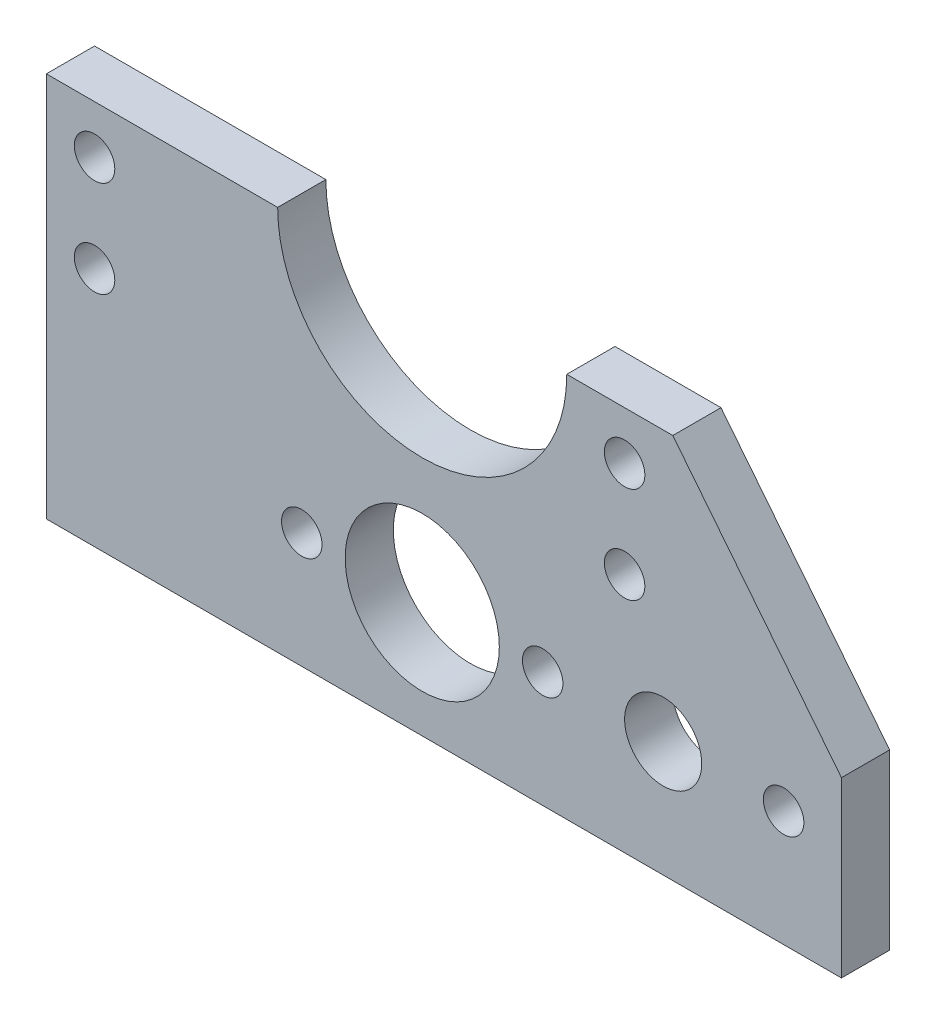
ISO-10303-21;
HEADER;
FILE_DESCRIPTION(('STEP AP214'),'2;1');
FILE_NAME('part.step','',(''),(''),'','','');
FILE_SCHEMA(('AUTOMOTIVE_DESIGN { 1 0 10303 214 1 1 1 1 }'));
ENDSEC;
DATA;
#1=APPLICATION_CONTEXT('core data for automotive mechanical design processes');
#2=APPLICATION_PROTOCOL_DEFINITION('international standard','automotive_design',2000,#1);
#3=PRODUCT_CONTEXT('',#1,'mechanical');
#4=PRODUCT('Part','Part','',(#3));
#5=PRODUCT_RELATED_PRODUCT_CATEGORY('part','',(#4));
#6=PRODUCT_DEFINITION_FORMATION('','',#4);
#7=PRODUCT_DEFINITION_CONTEXT('part definition',#1,'design');
#8=PRODUCT_DEFINITION('design','',#6,#7);
#9=PRODUCT_DEFINITION_SHAPE('','',#8);
#10=(LENGTH_UNIT() NAMED_UNIT(*) SI_UNIT(.MILLI.,.METRE.));
#11=(NAMED_UNIT(*) PLANE_ANGLE_UNIT() SI_UNIT($,.RADIAN.));
#12=(NAMED_UNIT(*) SI_UNIT($,.STERADIAN.) SOLID_ANGLE_UNIT());
#13=UNCERTAINTY_MEASURE_WITH_UNIT(LENGTH_MEASURE(1.E-05),#10,'distance_accuracy_value','');
#14=(GEOMETRIC_REPRESENTATION_CONTEXT(3) GLOBAL_UNCERTAINTY_ASSIGNED_CONTEXT((#13)) GLOBAL_UNIT_ASSIGNED_CONTEXT((#10,
#11,#12)) REPRESENTATION_CONTEXT('',''));
#15=CARTESIAN_POINT('',(0.,0.,0.));
#16=DIRECTION('',(0.,0.,1.));
#17=DIRECTION('',(1.,0.,0.));
#18=AXIS2_PLACEMENT_3D('',#15,#16,#17);
#19=CARTESIAN_POINT('',(116.611470678347,15.3385093167702,5.));
#20=DIRECTION('',(0.,-1.,0.));
#21=DIRECTION('',(1.,0.,0.));
#22=AXIS2_PLACEMENT_3D('',#19,#20,#21);
#23=PLANE('',#22);
#24=DIRECTION('',(-1.,0.,0.));
#25=VECTOR('',#24,1.);
#26=CARTESIAN_POINT('',(116.611470678347,15.3385093167702,0.));
#27=LINE('',#26,#25);
#28=CARTESIAN_POINT('',(116.611470678347,15.3385093167702,0.));
#29=VERTEX_POINT('',#28);
#30=CARTESIAN_POINT('',(105.611470678347,15.3385093167702,0.));
#31=VERTEX_POINT('',#30);
#32=EDGE_CURVE('E136',#29,#31,#27,.T.);
#33=ORIENTED_EDGE('',*,*,#32,.T.);
#34=DIRECTION('',(0.,0.,1.));
#35=VECTOR('',#34,1.);
#36=CARTESIAN_POINT('',(105.611470678347,15.3385093167702,-5.));
#37=LINE('',#36,#35);
#38=CARTESIAN_POINT('',(105.611470678347,15.3385093167702,5.));
#39=VERTEX_POINT('',#38);
#40=EDGE_CURVE('E11',#31,#39,#37,.T.);
#41=ORIENTED_EDGE('',*,*,#40,.T.);
#42=DIRECTION('',(-1.,0.,0.));
#43=VECTOR('',#42,1.);
#44=CARTESIAN_POINT('',(116.611470678347,15.3385093167702,5.));
#45=LINE('',#44,#43);
#46=CARTESIAN_POINT('',(116.611470678347,15.3385093167702,5.));
#47=VERTEX_POINT('',#46);
#48=EDGE_CURVE('E125',#47,#39,#45,.T.);
#49=ORIENTED_EDGE('',*,*,#48,.F.);
#50=DIRECTION('',(0.,0.,-1.));
#51=VECTOR('',#50,1.);
#52=CARTESIAN_POINT('',(116.611470678347,15.3385093167702,5.));
#53=LINE('',#52,#51);
#54=EDGE_CURVE('E119',#47,#29,#53,.T.);
#55=ORIENTED_EDGE('',*,*,#54,.T.);
#56=EDGE_LOOP('',(#33,#41,#49,#55));
#57=FACE_BOUND('',#56,.T.);
#58=ADVANCED_FACE('F36',(#57),#23,.F.);
#59=CARTESIAN_POINT('',(0.,0.,5.));
#60=DIRECTION('',(0.,0.,1.));
#61=DIRECTION('',(1.,0.,0.));
#62=AXIS2_PLACEMENT_3D('',#59,#60,#61);
#63=PLANE('',#62);
#64=CARTESIAN_POINT('',(90.6114706783472,15.3385093167702,5.));
#65=DIRECTION('',(0.,0.,1.));
#66=DIRECTION('',(1.,0.,0.));
#67=AXIS2_PLACEMENT_3D('',#64,#65,#66);
#68=CIRCLE('',#67,15.);
#69=CARTESIAN_POINT('',(75.6114706783472,15.3385093167702,5.));
#70=VERTEX_POINT('',#69);
#71=EDGE_CURVE('E160',#70,#39,#68,.T.);
#72=ORIENTED_EDGE('',*,*,#71,.F.);
#73=CARTESIAN_POINT('',(51.6114706783472,15.3385093167702,5.));
#74=VERTEX_POINT('',#73);
#75=EDGE_CURVE('E60',#70,#74,#45,.T.);
#76=ORIENTED_EDGE('',*,*,#75,.T.);
#77=DIRECTION('',(0.,-1.,0.));
#78=VECTOR('',#77,1.);
#79=CARTESIAN_POINT('',(51.6114706783472,-6.6614906832298,5.));
#80=LINE('',#79,#78);
#81=CARTESIAN_POINT('',(51.6114706783472,-24.6614906832298,5.));
#82=VERTEX_POINT('',#81);
#83=EDGE_CURVE('E142',#74,#82,#80,.T.);
#84=ORIENTED_EDGE('',*,*,#83,.T.);
#85=DIRECTION('',(1.,0.,0.));
#86=VECTOR('',#85,1.);
#87=CARTESIAN_POINT('',(51.6114706783472,-24.6614906832298,5.));
#88=LINE('',#87,#86);
#89=CARTESIAN_POINT('',(134.111470678347,-24.6614906832298,5.));
#90=VERTEX_POINT('',#89);
#91=EDGE_CURVE('E94',#82,#90,#88,.T.);
#92=ORIENTED_EDGE('',*,*,#91,.T.);
#93=DIRECTION('',(0.,1.,0.));
#94=VECTOR('',#93,1.);
#95=CARTESIAN_POINT('',(134.111470678347,-6.66149068322979,5.));
#96=LINE('',#95,#94);
#97=CARTESIAN_POINT('',(134.111470678347,-6.66149068322979,5.));
#98=VERTEX_POINT('',#97);
#99=EDGE_CURVE('E100',#90,#98,#96,.T.);
#100=ORIENTED_EDGE('',*,*,#99,.T.);
#101=DIRECTION('',(-0.622523565821539,0.782601054175649,0.));
#102=VECTOR('',#101,1.);
#103=CARTESIAN_POINT('',(116.611470678347,15.3385093167702,5.));
#104=LINE('',#103,#102);
#105=EDGE_CURVE('E106',#98,#47,#104,.T.);
#106=ORIENTED_EDGE('',*,*,#105,.T.);
#107=ORIENTED_EDGE('',*,*,#48,.T.);
#108=EDGE_LOOP('',(#72,#76,#84,#92,#100,#106,#107));
#109=FACE_BOUND('',#108,.T.);
#110=CARTESIAN_POINT('',(103.111470678347,-12.6614906832298,5.));
#111=DIRECTION('',(0.,0.,1.));
#112=DIRECTION('',(1.,0.,0.));
#113=AXIS2_PLACEMENT_3D('',#110,#111,#112);
#114=CIRCLE('',#113,2.1);
#115=CARTESIAN_POINT('',(105.211470678347,-12.6614906832298,5.));
#116=VERTEX_POINT('',#115);
#117=EDGE_CURVE('E233',#116,#116,#114,.T.);
#118=ORIENTED_EDGE('',*,*,#117,.F.);
#119=EDGE_LOOP('',(#118));
#120=FACE_BOUND('',#119,.T.);
#121=CARTESIAN_POINT('',(90.6114706783472,-12.6614906832298,5.));
#122=DIRECTION('',(0.,0.,1.));
#123=DIRECTION('',(1.,0.,0.));
#124=AXIS2_PLACEMENT_3D('',#121,#122,#123);
#125=CIRCLE('',#124,8.00000000000001);
#126=CARTESIAN_POINT('',(98.6114706783472,-12.6614906832298,5.));
#127=VERTEX_POINT('',#126);
#128=EDGE_CURVE('E253',#127,#127,#125,.T.);
#129=ORIENTED_EDGE('',*,*,#128,.F.);
#130=EDGE_LOOP('',(#129));
#131=FACE_BOUND('',#130,.T.);
#132=CARTESIAN_POINT('',(111.611470678347,0.338509316770208,5.));
#133=DIRECTION('',(0.,0.,1.));
#134=DIRECTION('',(1.,0.,0.));
#135=AXIS2_PLACEMENT_3D('',#132,#133,#134);
#136=CIRCLE('',#135,2.10000000000002);
#137=CARTESIAN_POINT('',(113.711470678347,0.338509316770208,5.));
#138=VERTEX_POINT('',#137);
#139=EDGE_CURVE('E265',#138,#138,#136,.T.);
#140=ORIENTED_EDGE('',*,*,#139,.F.);
#141=EDGE_LOOP('',(#140));
#142=FACE_BOUND('',#141,.T.);
#143=CARTESIAN_POINT('',(111.611470678347,10.3385093167702,5.));
#144=DIRECTION('',(0.,0.,1.));
#145=DIRECTION('',(1.,0.,0.));
#146=AXIS2_PLACEMENT_3D('',#143,#144,#145);
#147=CIRCLE('',#146,2.09999999999999);
#148=CARTESIAN_POINT('',(113.711470678347,10.3385093167702,5.));
#149=VERTEX_POINT('',#148);
#150=EDGE_CURVE('E277',#149,#149,#147,.T.);
#151=ORIENTED_EDGE('',*,*,#150,.F.);
#152=EDGE_LOOP('',(#151));
#153=FACE_BOUND('',#152,.T.);
#154=CARTESIAN_POINT('',(56.6114706783472,10.3385093167702,5.));
#155=DIRECTION('',(0.,0.,1.));
#156=DIRECTION('',(1.,0.,0.));
#157=AXIS2_PLACEMENT_3D('',#154,#155,#156);
#158=CIRCLE('',#157,2.09999999999999);
#159=CARTESIAN_POINT('',(58.7114706783471,10.3385093167702,5.));
#160=VERTEX_POINT('',#159);
#161=EDGE_CURVE('E132',#160,#160,#158,.T.);
#162=ORIENTED_EDGE('',*,*,#161,.F.);
#163=EDGE_LOOP('',(#162));
#164=FACE_BOUND('',#163,.T.);
#165=CARTESIAN_POINT('',(56.6114706783472,0.338509316770203,5.));
#166=DIRECTION('',(0.,0.,1.));
#167=DIRECTION('',(1.,0.,0.));
#168=AXIS2_PLACEMENT_3D('',#165,#166,#167);
#169=CIRCLE('',#168,2.09999999999999);
#170=CARTESIAN_POINT('',(58.7114706783471,0.338509316770203,5.));
#171=VERTEX_POINT('',#170);
#172=EDGE_CURVE('E271',#171,#171,#169,.T.);
#173=ORIENTED_EDGE('',*,*,#172,.F.);
#174=EDGE_LOOP('',(#173));
#175=FACE_BOUND('',#174,.T.);
#176=CARTESIAN_POINT('',(115.611470678347,-12.6614906832298,5.));
#177=DIRECTION('',(0.,0.,1.));
#178=DIRECTION('',(1.,0.,0.));
#179=AXIS2_PLACEMENT_3D('',#176,#177,#178);
#180=CIRCLE('',#179,4.00000000000001);
#181=CARTESIAN_POINT('',(119.611470678347,-12.6614906832298,5.));
#182=VERTEX_POINT('',#181);
#183=EDGE_CURVE('E259',#182,#182,#180,.T.);
#184=ORIENTED_EDGE('',*,*,#183,.F.);
#185=EDGE_LOOP('',(#184));
#186=FACE_BOUND('',#185,.T.);
#187=CARTESIAN_POINT('',(78.1114706783472,-12.6614906832298,5.));
#188=DIRECTION('',(0.,0.,1.));
#189=DIRECTION('',(1.,0.,0.));
#190=AXIS2_PLACEMENT_3D('',#187,#188,#189);
#191=CIRCLE('',#190,2.1);
#192=CARTESIAN_POINT('',(80.2114706783472,-12.6614906832298,5.));
#193=VERTEX_POINT('',#192);
#194=EDGE_CURVE('E247',#193,#193,#191,.T.);
#195=ORIENTED_EDGE('',*,*,#194,.F.);
#196=EDGE_LOOP('',(#195));
#197=FACE_BOUND('',#196,.T.);
#198=CARTESIAN_POINT('',(128.111470678347,-12.6614906832298,5.));
#199=DIRECTION('',(0.,0.,1.));
#200=DIRECTION('',(1.,0.,0.));
#201=AXIS2_PLACEMENT_3D('',#198,#199,#200);
#202=CIRCLE('',#201,2.09999999999999);
#203=CARTESIAN_POINT('',(130.211470678347,-12.6614906832298,5.));
#204=VERTEX_POINT('',#203);
#205=EDGE_CURVE('E238',#204,#204,#202,.T.);
#206=ORIENTED_EDGE('',*,*,#205,.F.);
#207=EDGE_LOOP('',(#206));
#208=FACE_BOUND('',#207,.T.);
#209=ADVANCED_FACE('F102',(#109,#120,#131,#142,#153,#164,#175,#186,#197,#208),#63,.T.);
#210=CARTESIAN_POINT('',(0.,0.,0.));
#211=DIRECTION('',(0.,0.,1.));
#212=DIRECTION('',(1.,0.,0.));
#213=AXIS2_PLACEMENT_3D('',#210,#211,#212);
#214=PLANE('',#213);
#215=CARTESIAN_POINT('',(75.6114706783472,15.3385093167702,0.));
#216=VERTEX_POINT('',#215);
#217=CARTESIAN_POINT('',(51.6114706783472,15.3385093167702,0.));
#218=VERTEX_POINT('',#217);
#219=EDGE_CURVE('E85',#216,#218,#27,.T.);
#220=ORIENTED_EDGE('',*,*,#219,.F.);
#221=CARTESIAN_POINT('',(90.6114706783472,15.3385093167702,0.));
#222=DIRECTION('',(0.,0.,1.));
#223=DIRECTION('',(1.,0.,0.));
#224=AXIS2_PLACEMENT_3D('',#221,#222,#223);
#225=CIRCLE('',#224,15.);
#226=EDGE_CURVE('E51',#216,#31,#225,.T.);
#227=ORIENTED_EDGE('',*,*,#226,.T.);
#228=ORIENTED_EDGE('',*,*,#32,.F.);
#229=DIRECTION('',(-0.622523565821539,0.782601054175649,0.));
#230=VECTOR('',#229,1.);
#231=CARTESIAN_POINT('',(116.611470678347,15.3385093167702,0.));
#232=LINE('',#231,#230);
#233=CARTESIAN_POINT('',(134.111470678347,-6.66149068322979,0.));
#234=VERTEX_POINT('',#233);
#235=EDGE_CURVE('E134',#234,#29,#232,.T.);
#236=ORIENTED_EDGE('',*,*,#235,.F.);
#237=DIRECTION('',(0.,1.,0.));
#238=VECTOR('',#237,1.);
#239=CARTESIAN_POINT('',(134.111470678347,-6.66149068322979,0.));
#240=LINE('',#239,#238);
#241=CARTESIAN_POINT('',(134.111470678347,-24.6614906832298,0.));
#242=VERTEX_POINT('',#241);
#243=EDGE_CURVE('E115',#242,#234,#240,.T.);
#244=ORIENTED_EDGE('',*,*,#243,.F.);
#245=DIRECTION('',(1.,0.,0.));
#246=VECTOR('',#245,1.);
#247=CARTESIAN_POINT('',(134.111470678347,-24.6614906832298,0.));
#248=LINE('',#247,#246);
#249=CARTESIAN_POINT('',(51.6114706783472,-24.6614906832298,0.));
#250=VERTEX_POINT('',#249);
#251=EDGE_CURVE('E130',#250,#242,#248,.T.);
#252=ORIENTED_EDGE('',*,*,#251,.F.);
#253=DIRECTION('',(0.,-1.,0.));
#254=VECTOR('',#253,1.);
#255=CARTESIAN_POINT('',(51.6114706783472,15.3385093167702,0.));
#256=LINE('',#255,#254);
#257=EDGE_CURVE('E139',#218,#250,#256,.T.);
#258=ORIENTED_EDGE('',*,*,#257,.F.);
#259=EDGE_LOOP('',(#220,#227,#228,#236,#244,#252,#258));
#260=FACE_BOUND('',#259,.T.);
#261=CARTESIAN_POINT('',(56.6114706783472,10.3385093167702,0.));
#262=DIRECTION('',(0.,0.,1.));
#263=DIRECTION('',(1.,0.,0.));
#264=AXIS2_PLACEMENT_3D('',#261,#262,#263);
#265=CIRCLE('',#264,2.09999999999999);
#266=CARTESIAN_POINT('',(58.7114706783471,10.3385093167702,0.));
#267=VERTEX_POINT('',#266);
#268=EDGE_CURVE('E280',#267,#267,#265,.T.);
#269=ORIENTED_EDGE('',*,*,#268,.T.);
#270=EDGE_LOOP('',(#269));
#271=FACE_BOUND('',#270,.T.);
#272=CARTESIAN_POINT('',(111.611470678347,10.3385093167702,0.));
#273=DIRECTION('',(0.,0.,1.));
#274=DIRECTION('',(1.,0.,0.));
#275=AXIS2_PLACEMENT_3D('',#272,#273,#274);
#276=CIRCLE('',#275,2.09999999999999);
#277=CARTESIAN_POINT('',(113.711470678347,10.3385093167702,0.));
#278=VERTEX_POINT('',#277);
#279=EDGE_CURVE('E274',#278,#278,#276,.T.);
#280=ORIENTED_EDGE('',*,*,#279,.T.);
#281=EDGE_LOOP('',(#280));
#282=FACE_BOUND('',#281,.T.);
#283=CARTESIAN_POINT('',(56.6114706783472,0.338509316770203,0.));
#284=DIRECTION('',(0.,0.,1.));
#285=DIRECTION('',(1.,0.,0.));
#286=AXIS2_PLACEMENT_3D('',#283,#284,#285);
#287=CIRCLE('',#286,2.09999999999999);
#288=CARTESIAN_POINT('',(58.7114706783471,0.338509316770203,0.));
#289=VERTEX_POINT('',#288);
#290=EDGE_CURVE('E268',#289,#289,#287,.T.);
#291=ORIENTED_EDGE('',*,*,#290,.T.);
#292=EDGE_LOOP('',(#291));
#293=FACE_BOUND('',#292,.T.);
#294=CARTESIAN_POINT('',(111.611470678347,0.338509316770208,0.));
#295=DIRECTION('',(0.,0.,1.));
#296=DIRECTION('',(1.,0.,0.));
#297=AXIS2_PLACEMENT_3D('',#294,#295,#296);
#298=CIRCLE('',#297,2.10000000000002);
#299=CARTESIAN_POINT('',(113.711470678347,0.338509316770208,0.));
#300=VERTEX_POINT('',#299);
#301=EDGE_CURVE('E262',#300,#300,#298,.T.);
#302=ORIENTED_EDGE('',*,*,#301,.T.);
#303=EDGE_LOOP('',(#302));
#304=FACE_BOUND('',#303,.T.);
#305=CARTESIAN_POINT('',(115.611470678347,-12.6614906832298,0.));
#306=DIRECTION('',(0.,0.,1.));
#307=DIRECTION('',(1.,0.,0.));
#308=AXIS2_PLACEMENT_3D('',#305,#306,#307);
#309=CIRCLE('',#308,4.00000000000001);
#310=CARTESIAN_POINT('',(119.611470678347,-12.6614906832298,0.));
#311=VERTEX_POINT('',#310);
#312=EDGE_CURVE('E256',#311,#311,#309,.T.);
#313=ORIENTED_EDGE('',*,*,#312,.T.);
#314=EDGE_LOOP('',(#313));
#315=FACE_BOUND('',#314,.T.);
#316=CARTESIAN_POINT('',(90.6114706783472,-12.6614906832298,0.));
#317=DIRECTION('',(0.,0.,1.));
#318=DIRECTION('',(1.,0.,0.));
#319=AXIS2_PLACEMENT_3D('',#316,#317,#318);
#320=CIRCLE('',#319,8.00000000000001);
#321=CARTESIAN_POINT('',(98.6114706783472,-12.6614906832298,0.));
#322=VERTEX_POINT('',#321);
#323=EDGE_CURVE('E250',#322,#322,#320,.T.);
#324=ORIENTED_EDGE('',*,*,#323,.T.);
#325=EDGE_LOOP('',(#324));
#326=FACE_BOUND('',#325,.T.);
#327=CARTESIAN_POINT('',(78.1114706783472,-12.6614906832298,0.));
#328=DIRECTION('',(0.,0.,1.));
#329=DIRECTION('',(1.,0.,0.));
#330=AXIS2_PLACEMENT_3D('',#327,#328,#329);
#331=CIRCLE('',#330,2.1);
#332=CARTESIAN_POINT('',(80.2114706783472,-12.6614906832298,0.));
#333=VERTEX_POINT('',#332);
#334=EDGE_CURVE('E240',#333,#333,#331,.T.);
#335=ORIENTED_EDGE('',*,*,#334,.T.);
#336=EDGE_LOOP('',(#335));
#337=FACE_BOUND('',#336,.T.);
#338=CARTESIAN_POINT('',(103.111470678347,-12.6614906832298,0.));
#339=DIRECTION('',(0.,0.,1.));
#340=DIRECTION('',(1.,0.,0.));
#341=AXIS2_PLACEMENT_3D('',#338,#339,#340);
#342=CIRCLE('',#341,2.1);
#343=CARTESIAN_POINT('',(105.211470678347,-12.6614906832298,0.));
#344=VERTEX_POINT('',#343);
#345=EDGE_CURVE('E236',#344,#344,#342,.T.);
#346=ORIENTED_EDGE('',*,*,#345,.T.);
#347=EDGE_LOOP('',(#346));
#348=FACE_BOUND('',#347,.T.);
#349=CARTESIAN_POINT('',(128.111470678347,-12.6614906832298,0.));
#350=DIRECTION('',(0.,0.,1.));
#351=DIRECTION('',(1.,0.,0.));
#352=AXIS2_PLACEMENT_3D('',#349,#350,#351);
#353=CIRCLE('',#352,2.09999999999999);
#354=CARTESIAN_POINT('',(130.211470678347,-12.6614906832298,0.));
#355=VERTEX_POINT('',#354);
#356=EDGE_CURVE('E243',#355,#355,#353,.T.);
#357=ORIENTED_EDGE('',*,*,#356,.T.);
#358=EDGE_LOOP('',(#357));
#359=FACE_BOUND('',#358,.T.);
#360=ADVANCED_FACE('F152',(#260,#271,#282,#293,#304,#315,#326,#337,#348,#359),#214,.F.);
#361=CARTESIAN_POINT('',(134.111470678347,-24.6614906832298,5.));
#362=DIRECTION('',(0.,1.,0.));
#363=DIRECTION('',(-1.,0.,0.));
#364=AXIS2_PLACEMENT_3D('',#361,#362,#363);
#365=PLANE('',#364);
#366=ORIENTED_EDGE('',*,*,#251,.T.);
#367=DIRECTION('',(0.,0.,-1.));
#368=VECTOR('',#367,1.);
#369=CARTESIAN_POINT('',(134.111470678347,-24.6614906832298,5.));
#370=LINE('',#369,#368);
#371=EDGE_CURVE('E118',#90,#242,#370,.T.);
#372=ORIENTED_EDGE('',*,*,#371,.F.);
#373=ORIENTED_EDGE('',*,*,#91,.F.);
#374=DIRECTION('',(0.,0.,-1.));
#375=VECTOR('',#374,1.);
#376=CARTESIAN_POINT('',(51.6114706783472,-24.6614906832298,5.));
#377=LINE('',#376,#375);
#378=EDGE_CURVE('E146',#82,#250,#377,.T.);
#379=ORIENTED_EDGE('',*,*,#378,.T.);
#380=EDGE_LOOP('',(#366,#372,#373,#379));
#381=FACE_BOUND('',#380,.T.);
#382=ADVANCED_FACE('F38',(#381),#365,.F.);
#383=CARTESIAN_POINT('',(134.111470678347,-6.66149068322979,5.));
#384=DIRECTION('',(-1.,0.,0.));
#385=DIRECTION('',(0.,0.,1.));
#386=AXIS2_PLACEMENT_3D('',#383,#384,#385);
#387=PLANE('',#386);
#388=ORIENTED_EDGE('',*,*,#243,.T.);
#389=DIRECTION('',(0.,0.,-1.));
#390=VECTOR('',#389,1.);
#391=CARTESIAN_POINT('',(134.111470678347,-6.66149068322979,5.));
#392=LINE('',#391,#390);
#393=EDGE_CURVE('E112',#98,#234,#392,.T.);
#394=ORIENTED_EDGE('',*,*,#393,.F.);
#395=ORIENTED_EDGE('',*,*,#99,.F.);
#396=ORIENTED_EDGE('',*,*,#371,.T.);
#397=EDGE_LOOP('',(#388,#394,#395,#396));
#398=FACE_BOUND('',#397,.T.);
#399=ADVANCED_FACE('F113',(#398),#387,.F.);
#400=CARTESIAN_POINT('',(116.611470678347,15.3385093167702,5.));
#401=DIRECTION('',(-0.782601054175649,-0.622523565821539,0.));
#402=DIRECTION('',(0.622523565821539,-0.782601054175649,0.));
#403=AXIS2_PLACEMENT_3D('',#400,#401,#402);
#404=PLANE('',#403);
#405=ORIENTED_EDGE('',*,*,#235,.T.);
#406=ORIENTED_EDGE('',*,*,#54,.F.);
#407=ORIENTED_EDGE('',*,*,#105,.F.);
#408=ORIENTED_EDGE('',*,*,#393,.T.);
#409=EDGE_LOOP('',(#405,#406,#407,#408));
#410=FACE_BOUND('',#409,.T.);
#411=ADVANCED_FACE('F121',(#410),#404,.F.);
#412=ORIENTED_EDGE('',*,*,#75,.F.);
#413=DIRECTION('',(0.,0.,1.));
#414=VECTOR('',#413,1.);
#415=CARTESIAN_POINT('',(75.6114706783472,15.3385093167702,-5.));
#416=LINE('',#415,#414);
#417=EDGE_CURVE('E44',#70,#216,#416,.F.);
#418=ORIENTED_EDGE('',*,*,#417,.T.);
#419=ORIENTED_EDGE('',*,*,#219,.T.);
#420=DIRECTION('',(0.,0.,-1.));
#421=VECTOR('',#420,1.);
#422=CARTESIAN_POINT('',(51.6114706783472,15.3385093167702,5.));
#423=LINE('',#422,#421);
#424=EDGE_CURVE('E129',#74,#218,#423,.T.);
#425=ORIENTED_EDGE('',*,*,#424,.F.);
#426=EDGE_LOOP('',(#412,#418,#419,#425));
#427=FACE_BOUND('',#426,.T.);
#428=ADVANCED_FACE('F147',(#427),#23,.F.);
#429=CARTESIAN_POINT('',(51.6114706783472,15.3385093167702,5.));
#430=DIRECTION('',(1.,0.,0.));
#431=DIRECTION('',(0.,0.,-1.));
#432=AXIS2_PLACEMENT_3D('',#429,#430,#431);
#433=PLANE('',#432);
#434=ORIENTED_EDGE('',*,*,#257,.T.);
#435=ORIENTED_EDGE('',*,*,#378,.F.);
#436=ORIENTED_EDGE('',*,*,#83,.F.);
#437=ORIENTED_EDGE('',*,*,#424,.T.);
#438=EDGE_LOOP('',(#434,#435,#436,#437));
#439=FACE_BOUND('',#438,.T.);
#440=ADVANCED_FACE('F157',(#439),#433,.F.);
#441=CARTESIAN_POINT('',(56.6114706783472,10.3385093167702,5.));
#442=DIRECTION('',(0.,0.,-1.));
#443=DIRECTION('',(-1.,0.,0.));
#444=AXIS2_PLACEMENT_3D('',#441,#442,#443);
#445=CYLINDRICAL_SURFACE('',#444,2.09999999999999);
#446=ORIENTED_EDGE('',*,*,#161,.T.);
#447=EDGE_LOOP('',(#446));
#448=FACE_BOUND('',#447,.T.);
#449=ORIENTED_EDGE('',*,*,#268,.F.);
#450=EDGE_LOOP('',(#449));
#451=FACE_BOUND('',#450,.T.);
#452=ADVANCED_FACE('F185',(#448,#451),#445,.F.);
#453=CARTESIAN_POINT('',(111.611470678347,10.3385093167702,5.));
#454=DIRECTION('',(0.,0.,-1.));
#455=DIRECTION('',(-1.,0.,0.));
#456=AXIS2_PLACEMENT_3D('',#453,#454,#455);
#457=CYLINDRICAL_SURFACE('',#456,2.09999999999999);
#458=ORIENTED_EDGE('',*,*,#150,.T.);
#459=EDGE_LOOP('',(#458));
#460=FACE_BOUND('',#459,.T.);
#461=ORIENTED_EDGE('',*,*,#279,.F.);
#462=EDGE_LOOP('',(#461));
#463=FACE_BOUND('',#462,.T.);
#464=ADVANCED_FACE('F201',(#460,#463),#457,.F.);
#465=CARTESIAN_POINT('',(56.6114706783472,0.338509316770203,5.));
#466=DIRECTION('',(0.,0.,-1.));
#467=DIRECTION('',(-1.,0.,0.));
#468=AXIS2_PLACEMENT_3D('',#465,#466,#467);
#469=CYLINDRICAL_SURFACE('',#468,2.09999999999999);
#470=ORIENTED_EDGE('',*,*,#172,.T.);
#471=EDGE_LOOP('',(#470));
#472=FACE_BOUND('',#471,.T.);
#473=ORIENTED_EDGE('',*,*,#290,.F.);
#474=EDGE_LOOP('',(#473));
#475=FACE_BOUND('',#474,.T.);
#476=ADVANCED_FACE('F205',(#472,#475),#469,.F.);
#477=CARTESIAN_POINT('',(111.611470678347,0.338509316770208,5.));
#478=DIRECTION('',(0.,0.,-1.));
#479=DIRECTION('',(-1.,0.,0.));
#480=AXIS2_PLACEMENT_3D('',#477,#478,#479);
#481=CYLINDRICAL_SURFACE('',#480,2.10000000000002);
#482=ORIENTED_EDGE('',*,*,#139,.T.);
#483=EDGE_LOOP('',(#482));
#484=FACE_BOUND('',#483,.T.);
#485=ORIENTED_EDGE('',*,*,#301,.F.);
#486=EDGE_LOOP('',(#485));
#487=FACE_BOUND('',#486,.T.);
#488=ADVANCED_FACE('F209',(#484,#487),#481,.F.);
#489=CARTESIAN_POINT('',(115.611470678347,-12.6614906832298,5.));
#490=DIRECTION('',(0.,0.,-1.));
#491=DIRECTION('',(-1.,0.,0.));
#492=AXIS2_PLACEMENT_3D('',#489,#490,#491);
#493=CYLINDRICAL_SURFACE('',#492,4.00000000000001);
#494=ORIENTED_EDGE('',*,*,#183,.T.);
#495=EDGE_LOOP('',(#494));
#496=FACE_BOUND('',#495,.T.);
#497=ORIENTED_EDGE('',*,*,#312,.F.);
#498=EDGE_LOOP('',(#497));
#499=FACE_BOUND('',#498,.T.);
#500=ADVANCED_FACE('F213',(#496,#499),#493,.F.);
#501=CARTESIAN_POINT('',(90.6114706783472,-12.6614906832298,5.));
#502=DIRECTION('',(0.,0.,-1.));
#503=DIRECTION('',(-1.,0.,0.));
#504=AXIS2_PLACEMENT_3D('',#501,#502,#503);
#505=CYLINDRICAL_SURFACE('',#504,8.00000000000001);
#506=ORIENTED_EDGE('',*,*,#128,.T.);
#507=EDGE_LOOP('',(#506));
#508=FACE_BOUND('',#507,.T.);
#509=ORIENTED_EDGE('',*,*,#323,.F.);
#510=EDGE_LOOP('',(#509));
#511=FACE_BOUND('',#510,.T.);
#512=ADVANCED_FACE('F217',(#508,#511),#505,.F.);
#513=CARTESIAN_POINT('',(78.1114706783472,-12.6614906832298,5.));
#514=DIRECTION('',(0.,0.,-1.));
#515=DIRECTION('',(-1.,0.,0.));
#516=AXIS2_PLACEMENT_3D('',#513,#514,#515);
#517=CYLINDRICAL_SURFACE('',#516,2.1);
#518=ORIENTED_EDGE('',*,*,#194,.T.);
#519=EDGE_LOOP('',(#518));
#520=FACE_BOUND('',#519,.T.);
#521=ORIENTED_EDGE('',*,*,#334,.F.);
#522=EDGE_LOOP('',(#521));
#523=FACE_BOUND('',#522,.T.);
#524=ADVANCED_FACE('F221',(#520,#523),#517,.F.);
#525=CARTESIAN_POINT('',(103.111470678347,-12.6614906832298,5.));
#526=DIRECTION('',(0.,0.,-1.));
#527=DIRECTION('',(-1.,0.,0.));
#528=AXIS2_PLACEMENT_3D('',#525,#526,#527);
#529=CYLINDRICAL_SURFACE('',#528,2.1);
#530=ORIENTED_EDGE('',*,*,#117,.T.);
#531=EDGE_LOOP('',(#530));
#532=FACE_BOUND('',#531,.T.);
#533=ORIENTED_EDGE('',*,*,#345,.F.);
#534=EDGE_LOOP('',(#533));
#535=FACE_BOUND('',#534,.T.);
#536=ADVANCED_FACE('F169',(#532,#535),#529,.F.);
#537=CARTESIAN_POINT('',(128.111470678347,-12.6614906832298,5.));
#538=DIRECTION('',(0.,0.,-1.));
#539=DIRECTION('',(-1.,0.,0.));
#540=AXIS2_PLACEMENT_3D('',#537,#538,#539);
#541=CYLINDRICAL_SURFACE('',#540,2.09999999999999);
#542=ORIENTED_EDGE('',*,*,#205,.T.);
#543=EDGE_LOOP('',(#542));
#544=FACE_BOUND('',#543,.T.);
#545=ORIENTED_EDGE('',*,*,#356,.F.);
#546=EDGE_LOOP('',(#545));
#547=FACE_BOUND('',#546,.T.);
#548=ADVANCED_FACE('F164',(#544,#547),#541,.F.);
#549=CARTESIAN_POINT('',(90.6114706783472,15.3385093167702,-5.));
#550=DIRECTION('',(0.,0.,1.));
#551=DIRECTION('',(1.,0.,0.));
#552=AXIS2_PLACEMENT_3D('',#549,#550,#551);
#553=CYLINDRICAL_SURFACE('',#552,15.);
#554=ORIENTED_EDGE('',*,*,#226,.F.);
#555=ORIENTED_EDGE('',*,*,#417,.F.);
#556=ORIENTED_EDGE('',*,*,#71,.T.);
#557=ORIENTED_EDGE('',*,*,#40,.F.);
#558=EDGE_LOOP('',(#554,#555,#556,#557));
#559=FACE_BOUND('',#558,.T.);
#560=ADVANCED_FACE('F162',(#559),#553,.F.);
#561=CLOSED_SHELL('',(#58,#209,#360,#382,#399,#411,#428,#440,#452,#464,#476,#488,#500,#512,#524,
#536,#548,#560));
#562=MANIFOLD_SOLID_BREP('B2',#561);
#563=ADVANCED_BREP_SHAPE_REPRESENTATION('',(#18,#562),#14);
#564=SHAPE_DEFINITION_REPRESENTATION(#9,#563);
ENDSEC;
END-ISO-10303-21;
